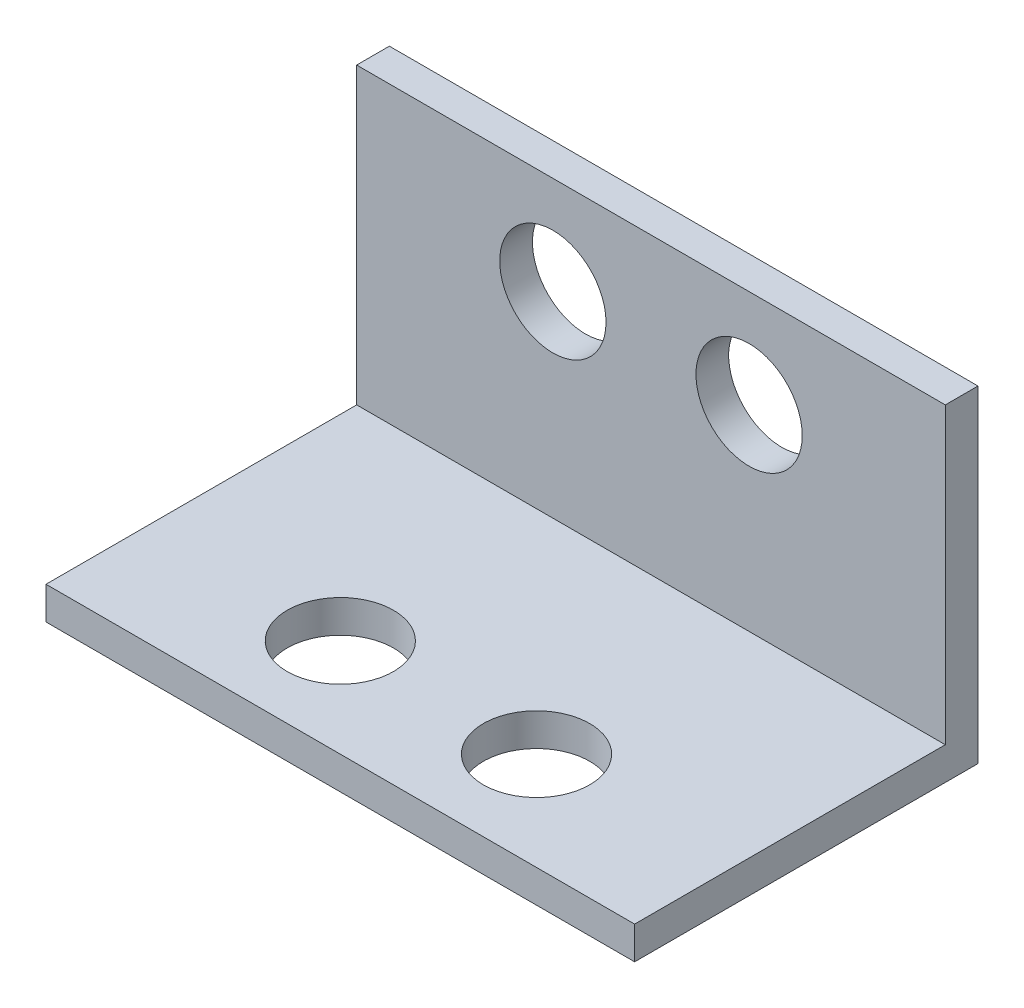
ISO-10303-21;
HEADER;
FILE_DESCRIPTION(('STEP AP214'),'2;1');
FILE_NAME('part.step','',(''),(''),'','','');
FILE_SCHEMA(('AUTOMOTIVE_DESIGN { 1 0 10303 214 1 1 1 1 }'));
ENDSEC;
DATA;
#1=APPLICATION_CONTEXT('core data for automotive mechanical design processes');
#2=APPLICATION_PROTOCOL_DEFINITION('international standard','automotive_design',2000,#1);
#3=PRODUCT_CONTEXT('',#1,'mechanical');
#4=PRODUCT('Part','Part','',(#3));
#5=PRODUCT_RELATED_PRODUCT_CATEGORY('part','',(#4));
#6=PRODUCT_DEFINITION_FORMATION('','',#4);
#7=PRODUCT_DEFINITION_CONTEXT('part definition',#1,'design');
#8=PRODUCT_DEFINITION('design','',#6,#7);
#9=PRODUCT_DEFINITION_SHAPE('','',#8);
#10=(LENGTH_UNIT() NAMED_UNIT(*) SI_UNIT(.MILLI.,.METRE.));
#11=(NAMED_UNIT(*) PLANE_ANGLE_UNIT() SI_UNIT($,.RADIAN.));
#12=(NAMED_UNIT(*) SI_UNIT($,.STERADIAN.) SOLID_ANGLE_UNIT());
#13=UNCERTAINTY_MEASURE_WITH_UNIT(LENGTH_MEASURE(1.E-05),#10,'distance_accuracy_value','');
#14=(GEOMETRIC_REPRESENTATION_CONTEXT(3) GLOBAL_UNCERTAINTY_ASSIGNED_CONTEXT((#13)) GLOBAL_UNIT_ASSIGNED_CONTEXT((#10,
#11,#12)) REPRESENTATION_CONTEXT('',''));
#15=CARTESIAN_POINT('',(0.,0.,0.));
#16=DIRECTION('',(0.,0.,1.));
#17=DIRECTION('',(1.,0.,0.));
#18=AXIS2_PLACEMENT_3D('',#15,#16,#17);
#19=CARTESIAN_POINT('',(0.,1.,0.));
#20=DIRECTION('',(0.,-1.,0.));
#21=DIRECTION('',(0.,0.,-1.));
#22=AXIS2_PLACEMENT_3D('',#19,#20,#21);
#23=PLANE('',#22);
#24=CARTESIAN_POINT('',(12.,1.,-3.));
#25=DIRECTION('',(0.,1.,0.));
#26=DIRECTION('',(0.,0.,1.));
#27=AXIS2_PLACEMENT_3D('',#24,#25,#26);
#28=CIRCLE('',#27,1.625);
#29=CARTESIAN_POINT('',(12.,1.,-1.375));
#30=VERTEX_POINT('',#29);
#31=EDGE_CURVE('E152',#30,#30,#28,.T.);
#32=ORIENTED_EDGE('',*,*,#31,.F.);
#33=EDGE_LOOP('',(#32));
#34=FACE_BOUND('',#33,.T.);
#35=CARTESIAN_POINT('',(6.,1.,-3.));
#36=DIRECTION('',(0.,1.,0.));
#37=DIRECTION('',(0.,0.,1.));
#38=AXIS2_PLACEMENT_3D('',#35,#36,#37);
#39=CIRCLE('',#38,1.625);
#40=CARTESIAN_POINT('',(6.,1.,-1.375));
#41=VERTEX_POINT('',#40);
#42=EDGE_CURVE('E111',#41,#41,#39,.T.);
#43=ORIENTED_EDGE('',*,*,#42,.F.);
#44=EDGE_LOOP('',(#43));
#45=FACE_BOUND('',#44,.T.);
#46=DIRECTION('',(1.,0.,0.));
#47=VECTOR('',#46,1.);
#48=CARTESIAN_POINT('',(0.,1.,-9.5));
#49=LINE('',#48,#47);
#50=CARTESIAN_POINT('',(0.,1.,-9.5));
#51=VERTEX_POINT('',#50);
#52=CARTESIAN_POINT('',(18.,1.,-9.5));
#53=VERTEX_POINT('',#52);
#54=EDGE_CURVE('E55',#51,#53,#49,.T.);
#55=ORIENTED_EDGE('',*,*,#54,.F.);
#56=DIRECTION('',(0.,0.,1.));
#57=VECTOR('',#56,1.);
#58=CARTESIAN_POINT('',(0.,1.,0.));
#59=LINE('',#58,#57);
#60=CARTESIAN_POINT('',(0.,1.,0.));
#61=VERTEX_POINT('',#60);
#62=EDGE_CURVE('E93',#51,#61,#59,.T.);
#63=ORIENTED_EDGE('',*,*,#62,.T.);
#64=DIRECTION('',(1.,0.,0.));
#65=VECTOR('',#64,1.);
#66=CARTESIAN_POINT('',(0.,1.,0.));
#67=LINE('',#66,#65);
#68=CARTESIAN_POINT('',(18.,1.,0.));
#69=VERTEX_POINT('',#68);
#70=EDGE_CURVE('E61',#61,#69,#67,.T.);
#71=ORIENTED_EDGE('',*,*,#70,.T.);
#72=DIRECTION('',(0.,0.,-1.));
#73=VECTOR('',#72,1.);
#74=CARTESIAN_POINT('',(18.,1.,0.));
#75=LINE('',#74,#73);
#76=EDGE_CURVE('E105',#69,#53,#75,.T.);
#77=ORIENTED_EDGE('',*,*,#76,.T.);
#78=EDGE_LOOP('',(#55,#63,#71,#77));
#79=FACE_BOUND('',#78,.T.);
#80=ADVANCED_FACE('F39',(#34,#45,#79),#23,.F.);
#81=CARTESIAN_POINT('',(0.,0.,0.));
#82=DIRECTION('',(0.,-1.,0.));
#83=DIRECTION('',(0.,0.,-1.));
#84=AXIS2_PLACEMENT_3D('',#81,#82,#83);
#85=PLANE('',#84);
#86=CARTESIAN_POINT('',(6.,0.,-3.));
#87=DIRECTION('',(0.,1.,0.));
#88=DIRECTION('',(0.,0.,1.));
#89=AXIS2_PLACEMENT_3D('',#86,#87,#88);
#90=CIRCLE('',#89,1.625);
#91=CARTESIAN_POINT('',(6.,0.,-1.375));
#92=VERTEX_POINT('',#91);
#93=EDGE_CURVE('E117',#92,#92,#90,.T.);
#94=ORIENTED_EDGE('',*,*,#93,.T.);
#95=EDGE_LOOP('',(#94));
#96=FACE_BOUND('',#95,.T.);
#97=DIRECTION('',(0.,0.,1.));
#98=VECTOR('',#97,1.);
#99=CARTESIAN_POINT('',(0.,0.,0.));
#100=LINE('',#99,#98);
#101=CARTESIAN_POINT('',(0.,0.,-10.5));
#102=VERTEX_POINT('',#101);
#103=CARTESIAN_POINT('',(0.,0.,0.));
#104=VERTEX_POINT('',#103);
#105=EDGE_CURVE('E100',#102,#104,#100,.T.);
#106=ORIENTED_EDGE('',*,*,#105,.F.);
#107=DIRECTION('',(-1.,0.,0.));
#108=VECTOR('',#107,1.);
#109=CARTESIAN_POINT('',(0.,0.,-10.5));
#110=LINE('',#109,#108);
#111=CARTESIAN_POINT('',(18.,0.,-10.5));
#112=VERTEX_POINT('',#111);
#113=EDGE_CURVE('E81',#112,#102,#110,.T.);
#114=ORIENTED_EDGE('',*,*,#113,.F.);
#115=DIRECTION('',(0.,0.,-1.));
#116=VECTOR('',#115,1.);
#117=CARTESIAN_POINT('',(18.,0.,0.));
#118=LINE('',#117,#116);
#119=CARTESIAN_POINT('',(18.,0.,0.));
#120=VERTEX_POINT('',#119);
#121=EDGE_CURVE('E94',#120,#112,#118,.T.);
#122=ORIENTED_EDGE('',*,*,#121,.F.);
#123=DIRECTION('',(1.,0.,0.));
#124=VECTOR('',#123,1.);
#125=CARTESIAN_POINT('',(0.,0.,0.));
#126=LINE('',#125,#124);
#127=EDGE_CURVE('E109',#104,#120,#126,.T.);
#128=ORIENTED_EDGE('',*,*,#127,.F.);
#129=EDGE_LOOP('',(#106,#114,#122,#128));
#130=FACE_BOUND('',#129,.T.);
#131=CARTESIAN_POINT('',(12.,0.,-3.));
#132=DIRECTION('',(0.,1.,0.));
#133=DIRECTION('',(0.,0.,1.));
#134=AXIS2_PLACEMENT_3D('',#131,#132,#133);
#135=CIRCLE('',#134,1.625);
#136=CARTESIAN_POINT('',(12.,0.,-1.375));
#137=VERTEX_POINT('',#136);
#138=EDGE_CURVE('E146',#137,#137,#135,.T.);
#139=ORIENTED_EDGE('',*,*,#138,.T.);
#140=EDGE_LOOP('',(#139));
#141=FACE_BOUND('',#140,.T.);
#142=ADVANCED_FACE('F107',(#96,#130,#141),#85,.T.);
#143=CARTESIAN_POINT('',(0.,1.,0.));
#144=DIRECTION('',(1.,0.,0.));
#145=DIRECTION('',(0.,0.,-1.));
#146=AXIS2_PLACEMENT_3D('',#143,#144,#145);
#147=PLANE('',#146);
#148=ORIENTED_EDGE('',*,*,#105,.T.);
#149=DIRECTION('',(0.,-1.,0.));
#150=VECTOR('',#149,1.);
#151=CARTESIAN_POINT('',(0.,1.,0.));
#152=LINE('',#151,#150);
#153=EDGE_CURVE('E11',#61,#104,#152,.T.);
#154=ORIENTED_EDGE('',*,*,#153,.F.);
#155=ORIENTED_EDGE('',*,*,#62,.F.);
#156=DIRECTION('',(0.,-1.,0.));
#157=VECTOR('',#156,1.);
#158=CARTESIAN_POINT('',(0.,10.,-9.5));
#159=LINE('',#158,#157);
#160=CARTESIAN_POINT('',(0.,10.,-9.5));
#161=VERTEX_POINT('',#160);
#162=EDGE_CURVE('E135',#161,#51,#159,.T.);
#163=ORIENTED_EDGE('',*,*,#162,.F.);
#164=DIRECTION('',(0.,0.,1.));
#165=VECTOR('',#164,1.);
#166=CARTESIAN_POINT('',(0.,10.,-10.5));
#167=LINE('',#166,#165);
#168=CARTESIAN_POINT('',(0.,10.,-10.5));
#169=VERTEX_POINT('',#168);
#170=EDGE_CURVE('E103',#169,#161,#167,.T.);
#171=ORIENTED_EDGE('',*,*,#170,.F.);
#172=DIRECTION('',(0.,-1.,0.));
#173=VECTOR('',#172,1.);
#174=CARTESIAN_POINT('',(0.,1.,-10.5));
#175=LINE('',#174,#173);
#176=EDGE_CURVE('E85',#169,#102,#175,.T.);
#177=ORIENTED_EDGE('',*,*,#176,.T.);
#178=EDGE_LOOP('',(#148,#154,#155,#163,#171,#177));
#179=FACE_BOUND('',#178,.T.);
#180=ADVANCED_FACE('F41',(#179),#147,.F.);
#181=CARTESIAN_POINT('',(0.,1.,0.));
#182=DIRECTION('',(0.,0.,-1.));
#183=DIRECTION('',(-1.,0.,0.));
#184=AXIS2_PLACEMENT_3D('',#181,#182,#183);
#185=PLANE('',#184);
#186=ORIENTED_EDGE('',*,*,#127,.T.);
#187=DIRECTION('',(0.,-1.,0.));
#188=VECTOR('',#187,1.);
#189=CARTESIAN_POINT('',(18.,1.,0.));
#190=LINE('',#189,#188);
#191=EDGE_CURVE('E48',#69,#120,#190,.T.);
#192=ORIENTED_EDGE('',*,*,#191,.F.);
#193=ORIENTED_EDGE('',*,*,#70,.F.);
#194=ORIENTED_EDGE('',*,*,#153,.T.);
#195=EDGE_LOOP('',(#186,#192,#193,#194));
#196=FACE_BOUND('',#195,.T.);
#197=ADVANCED_FACE('F132',(#196),#185,.F.);
#198=CARTESIAN_POINT('',(18.,1.,0.));
#199=DIRECTION('',(-1.,0.,0.));
#200=DIRECTION('',(0.,0.,1.));
#201=AXIS2_PLACEMENT_3D('',#198,#199,#200);
#202=PLANE('',#201);
#203=ORIENTED_EDGE('',*,*,#121,.T.);
#204=DIRECTION('',(0.,-1.,0.));
#205=VECTOR('',#204,1.);
#206=CARTESIAN_POINT('',(18.,1.,-10.5));
#207=LINE('',#206,#205);
#208=CARTESIAN_POINT('',(18.,10.,-10.5));
#209=VERTEX_POINT('',#208);
#210=EDGE_CURVE('E88',#209,#112,#207,.T.);
#211=ORIENTED_EDGE('',*,*,#210,.F.);
#212=DIRECTION('',(0.,0.,-1.));
#213=VECTOR('',#212,1.);
#214=CARTESIAN_POINT('',(18.,10.,-10.5));
#215=LINE('',#214,#213);
#216=CARTESIAN_POINT('',(18.,10.,-9.5));
#217=VERTEX_POINT('',#216);
#218=EDGE_CURVE('E175',#217,#209,#215,.T.);
#219=ORIENTED_EDGE('',*,*,#218,.F.);
#220=DIRECTION('',(0.,-1.,0.));
#221=VECTOR('',#220,1.);
#222=CARTESIAN_POINT('',(18.,10.,-9.5));
#223=LINE('',#222,#221);
#224=EDGE_CURVE('E147',#217,#53,#223,.T.);
#225=ORIENTED_EDGE('',*,*,#224,.T.);
#226=ORIENTED_EDGE('',*,*,#76,.F.);
#227=ORIENTED_EDGE('',*,*,#191,.T.);
#228=EDGE_LOOP('',(#203,#211,#219,#225,#226,#227));
#229=FACE_BOUND('',#228,.T.);
#230=ADVANCED_FACE('F129',(#229),#202,.F.);
#231=CARTESIAN_POINT('',(0.,1.,-10.5));
#232=DIRECTION('',(0.,0.,1.));
#233=DIRECTION('',(1.,0.,0.));
#234=AXIS2_PLACEMENT_3D('',#231,#232,#233);
#235=PLANE('',#234);
#236=CARTESIAN_POINT('',(6.,7.,-10.5));
#237=DIRECTION('',(0.,0.,1.));
#238=DIRECTION('',(1.,0.,0.));
#239=AXIS2_PLACEMENT_3D('',#236,#237,#238);
#240=CIRCLE('',#239,1.625);
#241=CARTESIAN_POINT('',(7.625,7.,-10.5));
#242=VERTEX_POINT('',#241);
#243=EDGE_CURVE('E184',#242,#242,#240,.T.);
#244=ORIENTED_EDGE('',*,*,#243,.T.);
#245=EDGE_LOOP('',(#244));
#246=FACE_BOUND('',#245,.T.);
#247=CARTESIAN_POINT('',(12.,7.,-10.5));
#248=DIRECTION('',(0.,0.,1.));
#249=DIRECTION('',(1.,0.,0.));
#250=AXIS2_PLACEMENT_3D('',#247,#248,#249);
#251=CIRCLE('',#250,1.625);
#252=CARTESIAN_POINT('',(13.625,7.,-10.5));
#253=VERTEX_POINT('',#252);
#254=EDGE_CURVE('E194',#253,#253,#251,.T.);
#255=ORIENTED_EDGE('',*,*,#254,.T.);
#256=EDGE_LOOP('',(#255));
#257=FACE_BOUND('',#256,.T.);
#258=ORIENTED_EDGE('',*,*,#113,.T.);
#259=ORIENTED_EDGE('',*,*,#176,.F.);
#260=DIRECTION('',(-1.,0.,0.));
#261=VECTOR('',#260,1.);
#262=CARTESIAN_POINT('',(0.,10.,-10.5));
#263=LINE('',#262,#261);
#264=EDGE_CURVE('E154',#209,#169,#263,.T.);
#265=ORIENTED_EDGE('',*,*,#264,.F.);
#266=ORIENTED_EDGE('',*,*,#210,.T.);
#267=EDGE_LOOP('',(#258,#259,#265,#266));
#268=FACE_BOUND('',#267,.T.);
#269=ADVANCED_FACE('F83',(#246,#257,#268),#235,.F.);
#270=CARTESIAN_POINT('',(6.,1.,-3.));
#271=DIRECTION('',(0.,-1.,0.));
#272=DIRECTION('',(0.,0.,-1.));
#273=AXIS2_PLACEMENT_3D('',#270,#271,#272);
#274=CYLINDRICAL_SURFACE('',#273,1.625);
#275=ORIENTED_EDGE('',*,*,#42,.T.);
#276=EDGE_LOOP('',(#275));
#277=FACE_BOUND('',#276,.T.);
#278=ORIENTED_EDGE('',*,*,#93,.F.);
#279=EDGE_LOOP('',(#278));
#280=FACE_BOUND('',#279,.T.);
#281=ADVANCED_FACE('F216',(#277,#280),#274,.F.);
#282=CARTESIAN_POINT('',(12.,1.,-3.));
#283=DIRECTION('',(0.,-1.,0.));
#284=DIRECTION('',(0.,0.,-1.));
#285=AXIS2_PLACEMENT_3D('',#282,#283,#284);
#286=CYLINDRICAL_SURFACE('',#285,1.625);
#287=ORIENTED_EDGE('',*,*,#31,.T.);
#288=EDGE_LOOP('',(#287));
#289=FACE_BOUND('',#288,.T.);
#290=ORIENTED_EDGE('',*,*,#138,.F.);
#291=EDGE_LOOP('',(#290));
#292=FACE_BOUND('',#291,.T.);
#293=ADVANCED_FACE('F208',(#289,#292),#286,.F.);
#294=CARTESIAN_POINT('',(0.,10.,-9.5));
#295=DIRECTION('',(0.,0.,-1.));
#296=DIRECTION('',(-1.,0.,0.));
#297=AXIS2_PLACEMENT_3D('',#294,#295,#296);
#298=PLANE('',#297);
#299=CARTESIAN_POINT('',(6.,7.,-9.5));
#300=DIRECTION('',(0.,0.,1.));
#301=DIRECTION('',(1.,0.,0.));
#302=AXIS2_PLACEMENT_3D('',#299,#300,#301);
#303=CIRCLE('',#302,1.625);
#304=CARTESIAN_POINT('',(7.625,7.,-9.5));
#305=VERTEX_POINT('',#304);
#306=EDGE_CURVE('E188',#305,#305,#303,.T.);
#307=ORIENTED_EDGE('',*,*,#306,.F.);
#308=EDGE_LOOP('',(#307));
#309=FACE_BOUND('',#308,.T.);
#310=CARTESIAN_POINT('',(12.,7.,-9.5));
#311=DIRECTION('',(0.,0.,1.));
#312=DIRECTION('',(1.,0.,0.));
#313=AXIS2_PLACEMENT_3D('',#310,#311,#312);
#314=CIRCLE('',#313,1.625);
#315=CARTESIAN_POINT('',(13.625,7.,-9.5));
#316=VERTEX_POINT('',#315);
#317=EDGE_CURVE('E200',#316,#316,#314,.T.);
#318=ORIENTED_EDGE('',*,*,#317,.F.);
#319=EDGE_LOOP('',(#318));
#320=FACE_BOUND('',#319,.T.);
#321=ORIENTED_EDGE('',*,*,#54,.T.);
#322=ORIENTED_EDGE('',*,*,#224,.F.);
#323=DIRECTION('',(1.,0.,0.));
#324=VECTOR('',#323,1.);
#325=CARTESIAN_POINT('',(0.,10.,-9.5));
#326=LINE('',#325,#324);
#327=EDGE_CURVE('E144',#161,#217,#326,.T.);
#328=ORIENTED_EDGE('',*,*,#327,.F.);
#329=ORIENTED_EDGE('',*,*,#162,.T.);
#330=EDGE_LOOP('',(#321,#322,#328,#329));
#331=FACE_BOUND('',#330,.T.);
#332=ADVANCED_FACE('F140',(#309,#320,#331),#298,.F.);
#333=CARTESIAN_POINT('',(0.,10.,0.));
#334=DIRECTION('',(0.,1.,0.));
#335=DIRECTION('',(0.,0.,1.));
#336=AXIS2_PLACEMENT_3D('',#333,#334,#335);
#337=PLANE('',#336);
#338=ORIENTED_EDGE('',*,*,#170,.T.);
#339=ORIENTED_EDGE('',*,*,#327,.T.);
#340=ORIENTED_EDGE('',*,*,#218,.T.);
#341=ORIENTED_EDGE('',*,*,#264,.T.);
#342=EDGE_LOOP('',(#338,#339,#340,#341));
#343=FACE_BOUND('',#342,.T.);
#344=ADVANCED_FACE('F173',(#343),#337,.T.);
#345=CARTESIAN_POINT('',(12.,7.,-10.5));
#346=DIRECTION('',(0.,0.,1.));
#347=DIRECTION('',(1.,0.,0.));
#348=AXIS2_PLACEMENT_3D('',#345,#346,#347);
#349=CYLINDRICAL_SURFACE('',#348,1.625);
#350=ORIENTED_EDGE('',*,*,#254,.F.);
#351=EDGE_LOOP('',(#350));
#352=FACE_BOUND('',#351,.T.);
#353=ORIENTED_EDGE('',*,*,#317,.T.);
#354=EDGE_LOOP('',(#353));
#355=FACE_BOUND('',#354,.T.);
#356=ADVANCED_FACE('F205',(#352,#355),#349,.F.);
#357=CARTESIAN_POINT('',(6.,7.,-10.5));
#358=DIRECTION('',(0.,0.,1.));
#359=DIRECTION('',(1.,0.,0.));
#360=AXIS2_PLACEMENT_3D('',#357,#358,#359);
#361=CYLINDRICAL_SURFACE('',#360,1.625);
#362=ORIENTED_EDGE('',*,*,#243,.F.);
#363=EDGE_LOOP('',(#362));
#364=FACE_BOUND('',#363,.T.);
#365=ORIENTED_EDGE('',*,*,#306,.T.);
#366=EDGE_LOOP('',(#365));
#367=FACE_BOUND('',#366,.T.);
#368=ADVANCED_FACE('F307',(#364,#367),#361,.F.);
#369=CLOSED_SHELL('',(#80,#142,#180,#197,#230,#269,#281,#293,#332,#344,#356,#368));
#370=MANIFOLD_SOLID_BREP('B2',#369);
#371=ADVANCED_BREP_SHAPE_REPRESENTATION('',(#18,#370),#14);
#372=SHAPE_DEFINITION_REPRESENTATION(#9,#371);
ENDSEC;
END-ISO-10303-21;
